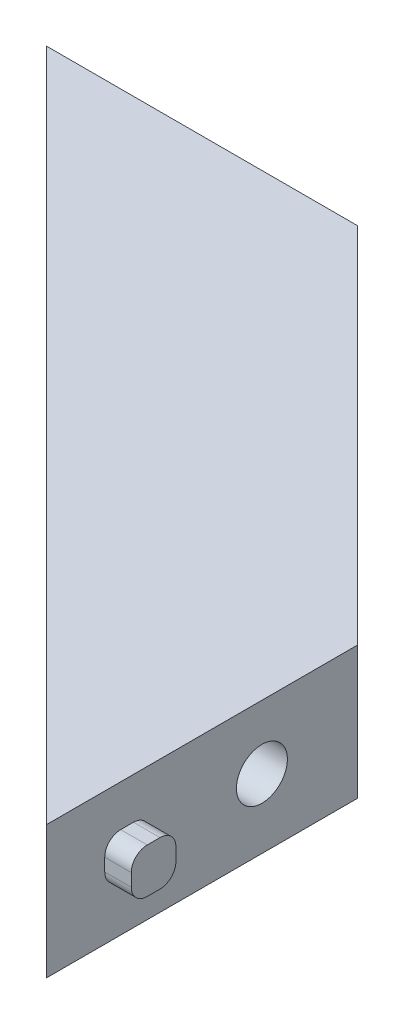
ISO-10303-21;
HEADER;
FILE_DESCRIPTION(('STEP AP214'),'2;1');
FILE_NAME('part.step','',(''),(''),'','','');
FILE_SCHEMA(('AUTOMOTIVE_DESIGN { 1 0 10303 214 1 1 1 1 }'));
ENDSEC;
DATA;
#1=APPLICATION_CONTEXT('core data for automotive mechanical design processes');
#2=APPLICATION_PROTOCOL_DEFINITION('international standard','automotive_design',2000,#1);
#3=PRODUCT_CONTEXT('',#1,'mechanical');
#4=PRODUCT('Part','Part','',(#3));
#5=PRODUCT_RELATED_PRODUCT_CATEGORY('part','',(#4));
#6=PRODUCT_DEFINITION_FORMATION('','',#4);
#7=PRODUCT_DEFINITION_CONTEXT('part definition',#1,'design');
#8=PRODUCT_DEFINITION('design','',#6,#7);
#9=PRODUCT_DEFINITION_SHAPE('','',#8);
#10=(LENGTH_UNIT() NAMED_UNIT(*) SI_UNIT(.MILLI.,.METRE.));
#11=(NAMED_UNIT(*) PLANE_ANGLE_UNIT() SI_UNIT($,.RADIAN.));
#12=(NAMED_UNIT(*) SI_UNIT($,.STERADIAN.) SOLID_ANGLE_UNIT());
#13=UNCERTAINTY_MEASURE_WITH_UNIT(LENGTH_MEASURE(1.E-05),#10,'distance_accuracy_value','');
#14=(GEOMETRIC_REPRESENTATION_CONTEXT(3) GLOBAL_UNCERTAINTY_ASSIGNED_CONTEXT((#13)) GLOBAL_UNIT_ASSIGNED_CONTEXT((#10,
#11,#12)) REPRESENTATION_CONTEXT('',''));
#15=CARTESIAN_POINT('',(0.,0.,0.));
#16=DIRECTION('',(0.,0.,1.));
#17=DIRECTION('',(1.,0.,0.));
#18=AXIS2_PLACEMENT_3D('',#15,#16,#17);
#19=CARTESIAN_POINT('',(1.74999999999999,6.49999999999973,11.45));
#20=DIRECTION('',(1.,0.,0.));
#21=DIRECTION('',(0.,0.,-1.));
#22=AXIS2_PLACEMENT_3D('',#19,#20,#21);
#23=CYLINDRICAL_SURFACE('',#22,2.4);
#24=CARTESIAN_POINT('',(31.75,6.49999999999973,11.45));
#25=DIRECTION('',(-1.,0.,0.));
#26=DIRECTION('',(0.,0.,1.));
#27=AXIS2_PLACEMENT_3D('',#24,#25,#26);
#28=CIRCLE('',#27,2.4);
#29=CARTESIAN_POINT('',(31.75,6.49999999999973,13.85));
#30=VERTEX_POINT('',#29);
#31=EDGE_CURVE('E222',#30,#30,#28,.T.);
#32=ORIENTED_EDGE('',*,*,#31,.F.);
#33=EDGE_LOOP('',(#32));
#34=FACE_BOUND('',#33,.T.);
#35=CARTESIAN_POINT('',(22.5938453699446,6.49999999999973,11.45));
#36=DIRECTION('',(-1.,0.,0.));
#37=DIRECTION('',(0.,0.,1.));
#38=AXIS2_PLACEMENT_3D('',#35,#36,#37);
#39=CIRCLE('',#38,2.4);
#40=CARTESIAN_POINT('',(22.5938453699446,6.49999999999973,13.85));
#41=VERTEX_POINT('',#40);
#42=EDGE_CURVE('E207',#41,#41,#39,.F.);
#43=ORIENTED_EDGE('',*,*,#42,.F.);
#44=EDGE_LOOP('',(#43));
#45=FACE_BOUND('',#44,.T.);
#46=ADVANCED_FACE('F32',(#34,#45),#23,.F.);
#47=CARTESIAN_POINT('',(-11.45,6.5,-1.75));
#48=DIRECTION('',(0.,0.,-1.));
#49=DIRECTION('',(-1.,0.,0.));
#50=AXIS2_PLACEMENT_3D('',#47,#48,#49);
#51=CYLINDRICAL_SURFACE('',#50,2.4);
#52=CARTESIAN_POINT('',(-11.45,6.5,-31.75));
#53=DIRECTION('',(0.,0.,1.));
#54=DIRECTION('',(1.,0.,0.));
#55=AXIS2_PLACEMENT_3D('',#52,#53,#54);
#56=CIRCLE('',#55,2.4);
#57=CARTESIAN_POINT('',(-9.05,6.5,-31.75));
#58=VERTEX_POINT('',#57);
#59=EDGE_CURVE('E206',#58,#58,#56,.T.);
#60=ORIENTED_EDGE('',*,*,#59,.F.);
#61=EDGE_LOOP('',(#60));
#62=FACE_BOUND('',#61,.T.);
#63=CARTESIAN_POINT('',(-11.45,6.5,-22.3111653809512));
#64=DIRECTION('',(0.,0.,1.));
#65=DIRECTION('',(1.,0.,0.));
#66=AXIS2_PLACEMENT_3D('',#63,#64,#65);
#67=CIRCLE('',#66,2.4);
#68=CARTESIAN_POINT('',(-9.05,6.5,-22.3111653809512));
#69=VERTEX_POINT('',#68);
#70=EDGE_CURVE('E200',#69,#69,#67,.F.);
#71=ORIENTED_EDGE('',*,*,#70,.F.);
#72=EDGE_LOOP('',(#71));
#73=FACE_BOUND('',#72,.T.);
#74=ADVANCED_FACE('F408',(#62,#73),#51,.F.);
#75=CARTESIAN_POINT('',(-31.75,12.5,-31.75));
#76=DIRECTION('',(0.,0.,1.));
#77=DIRECTION('',(1.,0.,0.));
#78=AXIS2_PLACEMENT_3D('',#75,#76,#77);
#79=PLANE('',#78);
#80=ORIENTED_EDGE('',*,*,#59,.T.);
#81=EDGE_LOOP('',(#80));
#82=FACE_BOUND('',#81,.T.);
#83=DIRECTION('',(-1.,0.,0.));
#84=VECTOR('',#83,1.);
#85=CARTESIAN_POINT('',(-31.75,12.5,-31.75));
#86=LINE('',#85,#84);
#87=CARTESIAN_POINT('',(-2.43430401491056,12.5,-31.75));
#88=VERTEX_POINT('',#87);
#89=CARTESIAN_POINT('',(-31.75,12.5,-31.75));
#90=VERTEX_POINT('',#89);
#91=EDGE_CURVE('E184',#88,#90,#86,.T.);
#92=ORIENTED_EDGE('',*,*,#91,.F.);
#93=DIRECTION('',(0.,1.,0.));
#94=VECTOR('',#93,1.);
#95=CARTESIAN_POINT('',(-2.43430401491056,0.,-31.75));
#96=LINE('',#95,#94);
#97=CARTESIAN_POINT('',(-2.43430401491056,0.,-31.75));
#98=VERTEX_POINT('',#97);
#99=EDGE_CURVE('E171',#98,#88,#96,.T.);
#100=ORIENTED_EDGE('',*,*,#99,.F.);
#101=DIRECTION('',(-1.,0.,0.));
#102=VECTOR('',#101,1.);
#103=CARTESIAN_POINT('',(-31.75,0.,-31.75));
#104=LINE('',#103,#102);
#105=CARTESIAN_POINT('',(-31.75,0.,-31.75));
#106=VERTEX_POINT('',#105);
#107=EDGE_CURVE('E183',#98,#106,#104,.T.);
#108=ORIENTED_EDGE('',*,*,#107,.T.);
#109=DIRECTION('',(0.,-1.,0.));
#110=VECTOR('',#109,1.);
#111=CARTESIAN_POINT('',(-31.75,12.5,-31.75));
#112=LINE('',#111,#110);
#113=EDGE_CURVE('E11',#90,#106,#112,.T.);
#114=ORIENTED_EDGE('',*,*,#113,.F.);
#115=EDGE_LOOP('',(#92,#100,#108,#114));
#116=FACE_BOUND('',#115,.T.);
#117=CARTESIAN_POINT('',(-24.75,5.9,-31.75));
#118=DIRECTION('',(0.,0.,-1.));
#119=DIRECTION('',(-1.,0.,0.));
#120=AXIS2_PLACEMENT_3D('',#117,#118,#119);
#121=CIRCLE('',#120,1.5);
#122=CARTESIAN_POINT('',(-24.75,4.4,-31.75));
#123=VERTEX_POINT('',#122);
#124=CARTESIAN_POINT('',(-26.25,5.90000000000001,-31.75));
#125=VERTEX_POINT('',#124);
#126=EDGE_CURVE('E226',#123,#125,#121,.T.);
#127=ORIENTED_EDGE('',*,*,#126,.F.);
#128=DIRECTION('',(-1.,0.,0.));
#129=VECTOR('',#128,1.);
#130=CARTESIAN_POINT('',(-24.75,4.4,-31.75));
#131=LINE('',#130,#129);
#132=CARTESIAN_POINT('',(-23.55,4.4,-31.75));
#133=VERTEX_POINT('',#132);
#134=EDGE_CURVE('E232',#133,#123,#131,.T.);
#135=ORIENTED_EDGE('',*,*,#134,.F.);
#136=CARTESIAN_POINT('',(-23.55,5.9,-31.75));
#137=DIRECTION('',(0.,0.,-1.));
#138=DIRECTION('',(1.,0.,0.));
#139=AXIS2_PLACEMENT_3D('',#136,#137,#138);
#140=CIRCLE('',#139,1.5);
#141=CARTESIAN_POINT('',(-22.05,5.9,-31.75));
#142=VERTEX_POINT('',#141);
#143=EDGE_CURVE('E262',#142,#133,#140,.T.);
#144=ORIENTED_EDGE('',*,*,#143,.F.);
#145=DIRECTION('',(0.,-1.,0.));
#146=VECTOR('',#145,1.);
#147=CARTESIAN_POINT('',(-22.05,5.90000000000001,-31.75));
#148=LINE('',#147,#146);
#149=CARTESIAN_POINT('',(-22.05,7.09999999999999,-31.75));
#150=VERTEX_POINT('',#149);
#151=EDGE_CURVE('E259',#150,#142,#148,.T.);
#152=ORIENTED_EDGE('',*,*,#151,.F.);
#153=CARTESIAN_POINT('',(-23.55,7.1,-31.75));
#154=DIRECTION('',(0.,0.,-1.));
#155=DIRECTION('',(-1.,0.,0.));
#156=AXIS2_PLACEMENT_3D('',#153,#154,#155);
#157=CIRCLE('',#156,1.5);
#158=CARTESIAN_POINT('',(-23.55,8.6,-31.75));
#159=VERTEX_POINT('',#158);
#160=EDGE_CURVE('E256',#159,#150,#157,.T.);
#161=ORIENTED_EDGE('',*,*,#160,.F.);
#162=DIRECTION('',(1.,0.,0.));
#163=VECTOR('',#162,1.);
#164=CARTESIAN_POINT('',(-24.75,8.6,-31.75));
#165=LINE('',#164,#163);
#166=CARTESIAN_POINT('',(-24.75,8.6,-31.75));
#167=VERTEX_POINT('',#166);
#168=EDGE_CURVE('E253',#167,#159,#165,.T.);
#169=ORIENTED_EDGE('',*,*,#168,.F.);
#170=CARTESIAN_POINT('',(-24.75,7.1,-31.75));
#171=DIRECTION('',(0.,0.,-1.));
#172=DIRECTION('',(-1.,0.,0.));
#173=AXIS2_PLACEMENT_3D('',#170,#171,#172);
#174=CIRCLE('',#173,1.5);
#175=CARTESIAN_POINT('',(-26.25,7.09999999999999,-31.75));
#176=VERTEX_POINT('',#175);
#177=EDGE_CURVE('E250',#176,#167,#174,.T.);
#178=ORIENTED_EDGE('',*,*,#177,.F.);
#179=DIRECTION('',(0.,1.,0.));
#180=VECTOR('',#179,1.);
#181=CARTESIAN_POINT('',(-26.25,5.90000000000001,-31.75));
#182=LINE('',#181,#180);
#183=EDGE_CURVE('E57',#125,#176,#182,.T.);
#184=ORIENTED_EDGE('',*,*,#183,.F.);
#185=EDGE_LOOP('',(#127,#135,#144,#152,#161,#169,#178,#184));
#186=FACE_BOUND('',#185,.T.);
#187=ADVANCED_FACE('F181',(#82,#116,#186),#79,.F.);
#188=CARTESIAN_POINT('',(31.75,12.5,31.75));
#189=DIRECTION('',(-1.,0.,0.));
#190=DIRECTION('',(0.,0.,1.));
#191=AXIS2_PLACEMENT_3D('',#188,#189,#190);
#192=PLANE('',#191);
#193=ORIENTED_EDGE('',*,*,#31,.T.);
#194=EDGE_LOOP('',(#193));
#195=FACE_BOUND('',#194,.T.);
#196=DIRECTION('',(0.,0.,-1.));
#197=VECTOR('',#196,1.);
#198=CARTESIAN_POINT('',(31.75,0.,31.75));
#199=LINE('',#198,#197);
#200=CARTESIAN_POINT('',(31.75,0.,31.75));
#201=VERTEX_POINT('',#200);
#202=CARTESIAN_POINT('',(31.75,0.,2.43430401491019));
#203=VERTEX_POINT('',#202);
#204=EDGE_CURVE('E189',#201,#203,#199,.T.);
#205=ORIENTED_EDGE('',*,*,#204,.T.);
#206=DIRECTION('',(0.,1.,0.));
#207=VECTOR('',#206,1.);
#208=CARTESIAN_POINT('',(31.75,0.,2.43430401491018));
#209=LINE('',#208,#207);
#210=CARTESIAN_POINT('',(31.75,12.5,2.43430401491018));
#211=VERTEX_POINT('',#210);
#212=EDGE_CURVE('E49',#203,#211,#209,.T.);
#213=ORIENTED_EDGE('',*,*,#212,.T.);
#214=DIRECTION('',(0.,0.,-1.));
#215=VECTOR('',#214,1.);
#216=CARTESIAN_POINT('',(31.75,12.5,31.75));
#217=LINE('',#216,#215);
#218=CARTESIAN_POINT('',(31.75,12.5,31.75));
#219=VERTEX_POINT('',#218);
#220=EDGE_CURVE('E191',#219,#211,#217,.T.);
#221=ORIENTED_EDGE('',*,*,#220,.F.);
#222=DIRECTION('',(0.,-1.,0.));
#223=VECTOR('',#222,1.);
#224=CARTESIAN_POINT('',(31.75,12.5,31.75));
#225=LINE('',#224,#223);
#226=EDGE_CURVE('E41',#219,#201,#225,.T.);
#227=ORIENTED_EDGE('',*,*,#226,.T.);
#228=EDGE_LOOP('',(#205,#213,#221,#227));
#229=FACE_BOUND('',#228,.T.);
#230=CARTESIAN_POINT('',(31.75,5.89999999999965,23.55));
#231=DIRECTION('',(1.,0.,0.));
#232=DIRECTION('',(0.,0.,-1.));
#233=AXIS2_PLACEMENT_3D('',#230,#231,#232);
#234=CIRCLE('',#233,1.5);
#235=CARTESIAN_POINT('',(31.75,4.39999999999965,23.55));
#236=VERTEX_POINT('',#235);
#237=CARTESIAN_POINT('',(31.75,5.89999999999966,22.05));
#238=VERTEX_POINT('',#237);
#239=EDGE_CURVE('E289',#236,#238,#234,.T.);
#240=ORIENTED_EDGE('',*,*,#239,.F.);
#241=DIRECTION('',(0.,0.,-1.));
#242=VECTOR('',#241,1.);
#243=CARTESIAN_POINT('',(31.75,4.39999999999965,24.75));
#244=LINE('',#243,#242);
#245=CARTESIAN_POINT('',(31.75,4.39999999999965,24.75));
#246=VERTEX_POINT('',#245);
#247=EDGE_CURVE('E294',#246,#236,#244,.T.);
#248=ORIENTED_EDGE('',*,*,#247,.F.);
#249=CARTESIAN_POINT('',(31.75,5.89999999999965,24.75));
#250=DIRECTION('',(1.,0.,0.));
#251=DIRECTION('',(0.,0.,1.));
#252=AXIS2_PLACEMENT_3D('',#249,#250,#251);
#253=CIRCLE('',#252,1.5);
#254=CARTESIAN_POINT('',(31.75,5.89999999999965,26.25));
#255=VERTEX_POINT('',#254);
#256=EDGE_CURVE('E326',#255,#246,#253,.T.);
#257=ORIENTED_EDGE('',*,*,#256,.F.);
#258=DIRECTION('',(0.,-1.,0.));
#259=VECTOR('',#258,1.);
#260=CARTESIAN_POINT('',(31.75,5.89999999999966,26.25));
#261=LINE('',#260,#259);
#262=CARTESIAN_POINT('',(31.75,7.09999999999963,26.25));
#263=VERTEX_POINT('',#262);
#264=EDGE_CURVE('E323',#263,#255,#261,.T.);
#265=ORIENTED_EDGE('',*,*,#264,.F.);
#266=CARTESIAN_POINT('',(31.75,7.09999999999965,24.75));
#267=DIRECTION('',(1.,0.,0.));
#268=DIRECTION('',(0.,0.,1.));
#269=AXIS2_PLACEMENT_3D('',#266,#267,#268);
#270=CIRCLE('',#269,1.5);
#271=CARTESIAN_POINT('',(31.75,8.59999999999965,24.75));
#272=VERTEX_POINT('',#271);
#273=EDGE_CURVE('E320',#272,#263,#270,.T.);
#274=ORIENTED_EDGE('',*,*,#273,.F.);
#275=DIRECTION('',(0.,0.,1.));
#276=VECTOR('',#275,1.);
#277=CARTESIAN_POINT('',(31.75,8.59999999999965,24.75));
#278=LINE('',#277,#276);
#279=CARTESIAN_POINT('',(31.75,8.59999999999965,23.55));
#280=VERTEX_POINT('',#279);
#281=EDGE_CURVE('E317',#280,#272,#278,.T.);
#282=ORIENTED_EDGE('',*,*,#281,.F.);
#283=CARTESIAN_POINT('',(31.75,7.09999999999965,23.55));
#284=DIRECTION('',(1.,0.,0.));
#285=DIRECTION('',(0.,0.,1.));
#286=AXIS2_PLACEMENT_3D('',#283,#284,#285);
#287=CIRCLE('',#286,1.5);
#288=CARTESIAN_POINT('',(31.75,7.09999999999963,22.05));
#289=VERTEX_POINT('',#288);
#290=EDGE_CURVE('E314',#289,#280,#287,.T.);
#291=ORIENTED_EDGE('',*,*,#290,.F.);
#292=DIRECTION('',(0.,1.,0.));
#293=VECTOR('',#292,1.);
#294=CARTESIAN_POINT('',(31.75,5.89999999999966,22.05));
#295=LINE('',#294,#293);
#296=EDGE_CURVE('E311',#238,#289,#295,.T.);
#297=ORIENTED_EDGE('',*,*,#296,.F.);
#298=EDGE_LOOP('',(#240,#248,#257,#265,#274,#282,#291,#297));
#299=FACE_BOUND('',#298,.T.);
#300=ADVANCED_FACE('F34',(#195,#229,#299),#192,.F.);
#301=CARTESIAN_POINT('',(-31.75,12.5,-31.75));
#302=DIRECTION('',(0.707106781186548,0.,-0.707106781186548));
#303=DIRECTION('',(-0.707106781186548,0.,-0.707106781186548));
#304=AXIS2_PLACEMENT_3D('',#301,#302,#303);
#305=PLANE('',#304);
#306=CARTESIAN_POINT('',(11.45,6.49999999999973,11.45));
#307=DIRECTION('',(0.707106781186548,0.,-0.707106781186548));
#308=DIRECTION('',(0.707106781186548,0.,0.707106781186548));
#309=AXIS2_PLACEMENT_3D('',#306,#307,#308);
#310=ELLIPSE('',#309,6.01040764008565,4.25);
#311=CARTESIAN_POINT('',(15.7,6.49999999999973,15.7));
#312=VERTEX_POINT('',#311);
#313=EDGE_CURVE('E36',#312,#312,#310,.F.);
#314=ORIENTED_EDGE('',*,*,#313,.F.);
#315=EDGE_LOOP('',(#314));
#316=FACE_BOUND('',#315,.T.);
#317=CARTESIAN_POINT('',(-11.45,6.5,-11.45));
#318=DIRECTION('',(0.707106781186548,0.,-0.707106781186548));
#319=DIRECTION('',(-0.707106781186548,0.,-0.707106781186548));
#320=AXIS2_PLACEMENT_3D('',#317,#318,#319);
#321=ELLIPSE('',#320,6.01040764008566,4.25);
#322=CARTESIAN_POINT('',(-15.7,6.5,-15.7));
#323=VERTEX_POINT('',#322);
#324=EDGE_CURVE('E203',#323,#323,#321,.F.);
#325=ORIENTED_EDGE('',*,*,#324,.F.);
#326=EDGE_LOOP('',(#325));
#327=FACE_BOUND('',#326,.T.);
#328=DIRECTION('',(0.707106781186548,0.,0.707106781186548));
#329=VECTOR('',#328,1.);
#330=CARTESIAN_POINT('',(-31.75,0.,-31.75));
#331=LINE('',#330,#329);
#332=EDGE_CURVE('E188',#106,#201,#331,.T.);
#333=ORIENTED_EDGE('',*,*,#332,.T.);
#334=ORIENTED_EDGE('',*,*,#226,.F.);
#335=DIRECTION('',(0.707106781186548,0.,0.707106781186548));
#336=VECTOR('',#335,1.);
#337=CARTESIAN_POINT('',(-31.75,12.5,-31.75));
#338=LINE('',#337,#336);
#339=EDGE_CURVE('E198',#90,#219,#338,.T.);
#340=ORIENTED_EDGE('',*,*,#339,.F.);
#341=ORIENTED_EDGE('',*,*,#113,.T.);
#342=EDGE_LOOP('',(#333,#334,#340,#341));
#343=FACE_BOUND('',#342,.T.);
#344=ADVANCED_FACE('F361',(#316,#327,#343),#305,.F.);
#345=CARTESIAN_POINT('',(0.,12.5,0.));
#346=DIRECTION('',(0.,-1.,0.));
#347=DIRECTION('',(0.,0.,-1.));
#348=AXIS2_PLACEMENT_3D('',#345,#346,#347);
#349=PLANE('',#348);
#350=ORIENTED_EDGE('',*,*,#220,.T.);
#351=DIRECTION('',(0.707106781186551,0.,0.707106781186544));
#352=VECTOR('',#351,1.);
#353=CARTESIAN_POINT('',(31.75,12.5,2.43430401491018));
#354=LINE('',#353,#352);
#355=EDGE_CURVE('E177',#88,#211,#354,.T.);
#356=ORIENTED_EDGE('',*,*,#355,.F.);
#357=ORIENTED_EDGE('',*,*,#91,.T.);
#358=ORIENTED_EDGE('',*,*,#339,.T.);
#359=EDGE_LOOP('',(#350,#356,#357,#358));
#360=FACE_BOUND('',#359,.T.);
#361=ADVANCED_FACE('F358',(#360),#349,.F.);
#362=CARTESIAN_POINT('',(0.,0.,0.));
#363=DIRECTION('',(0.,-1.,0.));
#364=DIRECTION('',(0.,0.,-1.));
#365=AXIS2_PLACEMENT_3D('',#362,#363,#364);
#366=PLANE('',#365);
#367=DIRECTION('',(0.707106781186551,0.,0.707106781186544));
#368=VECTOR('',#367,1.);
#369=CARTESIAN_POINT('',(31.75,0.,2.43430401491018));
#370=LINE('',#369,#368);
#371=EDGE_CURVE('E168',#98,#203,#370,.T.);
#372=ORIENTED_EDGE('',*,*,#371,.T.);
#373=ORIENTED_EDGE('',*,*,#204,.F.);
#374=ORIENTED_EDGE('',*,*,#332,.F.);
#375=ORIENTED_EDGE('',*,*,#107,.F.);
#376=EDGE_LOOP('',(#372,#373,#374,#375));
#377=FACE_BOUND('',#376,.T.);
#378=ADVANCED_FACE('F187',(#377),#366,.T.);
#379=CARTESIAN_POINT('',(34.25,5.89999999999965,23.55));
#380=DIRECTION('',(-1.,0.,0.));
#381=DIRECTION('',(0.,0.,1.));
#382=AXIS2_PLACEMENT_3D('',#379,#380,#381);
#383=CYLINDRICAL_SURFACE('',#382,1.5);
#384=ORIENTED_EDGE('',*,*,#239,.T.);
#385=DIRECTION('',(-1.,0.,0.));
#386=VECTOR('',#385,1.);
#387=CARTESIAN_POINT('',(34.25,5.89999999999966,22.05));
#388=LINE('',#387,#386);
#389=CARTESIAN_POINT('',(34.25,5.89999999999966,22.05));
#390=VERTEX_POINT('',#389);
#391=EDGE_CURVE('E193',#390,#238,#388,.T.);
#392=ORIENTED_EDGE('',*,*,#391,.F.);
#393=CARTESIAN_POINT('',(34.25,5.89999999999965,23.55));
#394=DIRECTION('',(1.,0.,0.));
#395=DIRECTION('',(0.,0.,-1.));
#396=AXIS2_PLACEMENT_3D('',#393,#394,#395);
#397=CIRCLE('',#396,1.5);
#398=CARTESIAN_POINT('',(34.25,4.39999999999965,23.55));
#399=VERTEX_POINT('',#398);
#400=EDGE_CURVE('E290',#399,#390,#397,.T.);
#401=ORIENTED_EDGE('',*,*,#400,.F.);
#402=DIRECTION('',(-1.,0.,0.));
#403=VECTOR('',#402,1.);
#404=CARTESIAN_POINT('',(34.25,4.39999999999965,23.55));
#405=LINE('',#404,#403);
#406=EDGE_CURVE('E308',#399,#236,#405,.T.);
#407=ORIENTED_EDGE('',*,*,#406,.T.);
#408=EDGE_LOOP('',(#384,#392,#401,#407));
#409=FACE_BOUND('',#408,.T.);
#410=ADVANCED_FACE('F374',(#409),#383,.T.);
#411=CARTESIAN_POINT('',(34.25,5.89999999999966,22.05));
#412=DIRECTION('',(0.,0.,1.));
#413=DIRECTION('',(1.,0.,0.));
#414=AXIS2_PLACEMENT_3D('',#411,#412,#413);
#415=PLANE('',#414);
#416=ORIENTED_EDGE('',*,*,#296,.T.);
#417=DIRECTION('',(-1.,0.,0.));
#418=VECTOR('',#417,1.);
#419=CARTESIAN_POINT('',(34.25,7.09999999999963,22.05));
#420=LINE('',#419,#418);
#421=CARTESIAN_POINT('',(34.25,7.09999999999963,22.05));
#422=VERTEX_POINT('',#421);
#423=EDGE_CURVE('E348',#422,#289,#420,.T.);
#424=ORIENTED_EDGE('',*,*,#423,.F.);
#425=DIRECTION('',(0.,1.,0.));
#426=VECTOR('',#425,1.);
#427=CARTESIAN_POINT('',(34.25,5.89999999999966,22.05));
#428=LINE('',#427,#426);
#429=EDGE_CURVE('E293',#390,#422,#428,.T.);
#430=ORIENTED_EDGE('',*,*,#429,.F.);
#431=ORIENTED_EDGE('',*,*,#391,.T.);
#432=EDGE_LOOP('',(#416,#424,#430,#431));
#433=FACE_BOUND('',#432,.T.);
#434=ADVANCED_FACE('F398',(#433),#415,.F.);
#435=CARTESIAN_POINT('',(34.25,7.09999999999965,23.55));
#436=DIRECTION('',(-1.,0.,0.));
#437=DIRECTION('',(0.,0.,1.));
#438=AXIS2_PLACEMENT_3D('',#435,#436,#437);
#439=CYLINDRICAL_SURFACE('',#438,1.5);
#440=ORIENTED_EDGE('',*,*,#290,.T.);
#441=DIRECTION('',(-1.,0.,0.));
#442=VECTOR('',#441,1.);
#443=CARTESIAN_POINT('',(34.25,8.59999999999965,23.55));
#444=LINE('',#443,#442);
#445=CARTESIAN_POINT('',(34.25,8.59999999999965,23.55));
#446=VERTEX_POINT('',#445);
#447=EDGE_CURVE('E345',#446,#280,#444,.T.);
#448=ORIENTED_EDGE('',*,*,#447,.F.);
#449=CARTESIAN_POINT('',(34.25,7.09999999999965,23.55));
#450=DIRECTION('',(1.,0.,0.));
#451=DIRECTION('',(0.,0.,1.));
#452=AXIS2_PLACEMENT_3D('',#449,#450,#451);
#453=CIRCLE('',#452,1.5);
#454=EDGE_CURVE('E296',#422,#446,#453,.T.);
#455=ORIENTED_EDGE('',*,*,#454,.F.);
#456=ORIENTED_EDGE('',*,*,#423,.T.);
#457=EDGE_LOOP('',(#440,#448,#455,#456));
#458=FACE_BOUND('',#457,.T.);
#459=ADVANCED_FACE('F396',(#458),#439,.T.);
#460=CARTESIAN_POINT('',(34.25,8.59999999999965,24.75));
#461=DIRECTION('',(0.,-1.,0.));
#462=DIRECTION('',(0.,0.,-1.));
#463=AXIS2_PLACEMENT_3D('',#460,#461,#462);
#464=PLANE('',#463);
#465=ORIENTED_EDGE('',*,*,#281,.T.);
#466=DIRECTION('',(-1.,0.,0.));
#467=VECTOR('',#466,1.);
#468=CARTESIAN_POINT('',(34.25,8.59999999999965,24.75));
#469=LINE('',#468,#467);
#470=CARTESIAN_POINT('',(34.25,8.59999999999965,24.75));
#471=VERTEX_POINT('',#470);
#472=EDGE_CURVE('E342',#471,#272,#469,.T.);
#473=ORIENTED_EDGE('',*,*,#472,.F.);
#474=DIRECTION('',(0.,0.,1.));
#475=VECTOR('',#474,1.);
#476=CARTESIAN_POINT('',(34.25,8.59999999999965,24.75));
#477=LINE('',#476,#475);
#478=EDGE_CURVE('E298',#446,#471,#477,.T.);
#479=ORIENTED_EDGE('',*,*,#478,.F.);
#480=ORIENTED_EDGE('',*,*,#447,.T.);
#481=EDGE_LOOP('',(#465,#473,#479,#480));
#482=FACE_BOUND('',#481,.T.);
#483=ADVANCED_FACE('F391',(#482),#464,.F.);
#484=CARTESIAN_POINT('',(34.25,7.09999999999965,24.75));
#485=DIRECTION('',(-1.,0.,0.));
#486=DIRECTION('',(0.,0.,1.));
#487=AXIS2_PLACEMENT_3D('',#484,#485,#486);
#488=CYLINDRICAL_SURFACE('',#487,1.5);
#489=ORIENTED_EDGE('',*,*,#273,.T.);
#490=DIRECTION('',(-1.,0.,0.));
#491=VECTOR('',#490,1.);
#492=CARTESIAN_POINT('',(34.25,7.09999999999963,26.25));
#493=LINE('',#492,#491);
#494=CARTESIAN_POINT('',(34.25,7.09999999999963,26.25));
#495=VERTEX_POINT('',#494);
#496=EDGE_CURVE('E339',#495,#263,#493,.T.);
#497=ORIENTED_EDGE('',*,*,#496,.F.);
#498=CARTESIAN_POINT('',(34.25,7.09999999999965,24.75));
#499=DIRECTION('',(1.,0.,0.));
#500=DIRECTION('',(0.,0.,1.));
#501=AXIS2_PLACEMENT_3D('',#498,#499,#500);
#502=CIRCLE('',#501,1.5);
#503=EDGE_CURVE('E300',#471,#495,#502,.T.);
#504=ORIENTED_EDGE('',*,*,#503,.F.);
#505=ORIENTED_EDGE('',*,*,#472,.T.);
#506=EDGE_LOOP('',(#489,#497,#504,#505));
#507=FACE_BOUND('',#506,.T.);
#508=ADVANCED_FACE('F388',(#507),#488,.T.);
#509=CARTESIAN_POINT('',(34.25,5.89999999999966,26.25));
#510=DIRECTION('',(0.,0.,-1.));
#511=DIRECTION('',(-1.,0.,0.));
#512=AXIS2_PLACEMENT_3D('',#509,#510,#511);
#513=PLANE('',#512);
#514=ORIENTED_EDGE('',*,*,#264,.T.);
#515=DIRECTION('',(-1.,0.,0.));
#516=VECTOR('',#515,1.);
#517=CARTESIAN_POINT('',(34.25,5.89999999999965,26.25));
#518=LINE('',#517,#516);
#519=CARTESIAN_POINT('',(34.25,5.89999999999965,26.25));
#520=VERTEX_POINT('',#519);
#521=EDGE_CURVE('E336',#520,#255,#518,.T.);
#522=ORIENTED_EDGE('',*,*,#521,.F.);
#523=DIRECTION('',(0.,-1.,0.));
#524=VECTOR('',#523,1.);
#525=CARTESIAN_POINT('',(34.25,5.89999999999966,26.25));
#526=LINE('',#525,#524);
#527=EDGE_CURVE('E302',#495,#520,#526,.T.);
#528=ORIENTED_EDGE('',*,*,#527,.F.);
#529=ORIENTED_EDGE('',*,*,#496,.T.);
#530=EDGE_LOOP('',(#514,#522,#528,#529));
#531=FACE_BOUND('',#530,.T.);
#532=ADVANCED_FACE('F384',(#531),#513,.F.);
#533=CARTESIAN_POINT('',(34.25,5.89999999999965,24.75));
#534=DIRECTION('',(-1.,0.,0.));
#535=DIRECTION('',(0.,0.,1.));
#536=AXIS2_PLACEMENT_3D('',#533,#534,#535);
#537=CYLINDRICAL_SURFACE('',#536,1.5);
#538=ORIENTED_EDGE('',*,*,#256,.T.);
#539=DIRECTION('',(-1.,0.,0.));
#540=VECTOR('',#539,1.);
#541=CARTESIAN_POINT('',(34.25,4.39999999999965,24.75));
#542=LINE('',#541,#540);
#543=CARTESIAN_POINT('',(34.25,4.39999999999965,24.75));
#544=VERTEX_POINT('',#543);
#545=EDGE_CURVE('E333',#544,#246,#542,.T.);
#546=ORIENTED_EDGE('',*,*,#545,.F.);
#547=CARTESIAN_POINT('',(34.25,5.89999999999965,24.75));
#548=DIRECTION('',(1.,0.,0.));
#549=DIRECTION('',(0.,0.,1.));
#550=AXIS2_PLACEMENT_3D('',#547,#548,#549);
#551=CIRCLE('',#550,1.5);
#552=EDGE_CURVE('E304',#520,#544,#551,.T.);
#553=ORIENTED_EDGE('',*,*,#552,.F.);
#554=ORIENTED_EDGE('',*,*,#521,.T.);
#555=EDGE_LOOP('',(#538,#546,#553,#554));
#556=FACE_BOUND('',#555,.T.);
#557=ADVANCED_FACE('F382',(#556),#537,.T.);
#558=CARTESIAN_POINT('',(34.25,4.39999999999965,24.75));
#559=DIRECTION('',(0.,1.,0.));
#560=DIRECTION('',(0.,0.,1.));
#561=AXIS2_PLACEMENT_3D('',#558,#559,#560);
#562=PLANE('',#561);
#563=ORIENTED_EDGE('',*,*,#247,.T.);
#564=ORIENTED_EDGE('',*,*,#406,.F.);
#565=DIRECTION('',(0.,0.,-1.));
#566=VECTOR('',#565,1.);
#567=CARTESIAN_POINT('',(34.25,4.39999999999965,24.75));
#568=LINE('',#567,#566);
#569=EDGE_CURVE('E306',#544,#399,#568,.T.);
#570=ORIENTED_EDGE('',*,*,#569,.F.);
#571=ORIENTED_EDGE('',*,*,#545,.T.);
#572=EDGE_LOOP('',(#563,#564,#570,#571));
#573=FACE_BOUND('',#572,.T.);
#574=ADVANCED_FACE('F370',(#573),#562,.F.);
#575=CARTESIAN_POINT('',(34.25,5.89999999999965,23.55));
#576=DIRECTION('',(1.,0.,0.));
#577=DIRECTION('',(0.,0.,-1.));
#578=AXIS2_PLACEMENT_3D('',#575,#576,#577);
#579=PLANE('',#578);
#580=ORIENTED_EDGE('',*,*,#400,.T.);
#581=ORIENTED_EDGE('',*,*,#429,.T.);
#582=ORIENTED_EDGE('',*,*,#454,.T.);
#583=ORIENTED_EDGE('',*,*,#478,.T.);
#584=ORIENTED_EDGE('',*,*,#503,.T.);
#585=ORIENTED_EDGE('',*,*,#527,.T.);
#586=ORIENTED_EDGE('',*,*,#552,.T.);
#587=ORIENTED_EDGE('',*,*,#569,.T.);
#588=EDGE_LOOP('',(#580,#581,#582,#583,#584,#585,#586,#587));
#589=FACE_BOUND('',#588,.T.);
#590=ADVANCED_FACE('F376',(#589),#579,.T.);
#591=CARTESIAN_POINT('',(-24.75,5.9,-34.25));
#592=DIRECTION('',(0.,0.,1.));
#593=DIRECTION('',(1.,0.,0.));
#594=AXIS2_PLACEMENT_3D('',#591,#592,#593);
#595=CYLINDRICAL_SURFACE('',#594,1.5);
#596=ORIENTED_EDGE('',*,*,#126,.T.);
#597=DIRECTION('',(0.,0.,1.));
#598=VECTOR('',#597,1.);
#599=CARTESIAN_POINT('',(-26.25,5.90000000000001,-34.25));
#600=LINE('',#599,#598);
#601=CARTESIAN_POINT('',(-26.25,5.90000000000001,-34.25));
#602=VERTEX_POINT('',#601);
#603=EDGE_CURVE('E287',#602,#125,#600,.T.);
#604=ORIENTED_EDGE('',*,*,#603,.F.);
#605=CARTESIAN_POINT('',(-24.75,5.9,-34.25));
#606=DIRECTION('',(0.,0.,-1.));
#607=DIRECTION('',(-1.,0.,0.));
#608=AXIS2_PLACEMENT_3D('',#605,#606,#607);
#609=CIRCLE('',#608,1.5);
#610=CARTESIAN_POINT('',(-24.75,4.4,-34.25));
#611=VERTEX_POINT('',#610);
#612=EDGE_CURVE('E228',#611,#602,#609,.T.);
#613=ORIENTED_EDGE('',*,*,#612,.F.);
#614=DIRECTION('',(0.,0.,1.));
#615=VECTOR('',#614,1.);
#616=CARTESIAN_POINT('',(-24.75,4.4,-34.25));
#617=LINE('',#616,#615);
#618=EDGE_CURVE('E246',#611,#123,#617,.T.);
#619=ORIENTED_EDGE('',*,*,#618,.T.);
#620=EDGE_LOOP('',(#596,#604,#613,#619));
#621=FACE_BOUND('',#620,.T.);
#622=ADVANCED_FACE('F456',(#621),#595,.T.);
#623=CARTESIAN_POINT('',(-26.25,5.90000000000001,-34.25));
#624=DIRECTION('',(1.,0.,0.));
#625=DIRECTION('',(0.,0.,-1.));
#626=AXIS2_PLACEMENT_3D('',#623,#624,#625);
#627=PLANE('',#626);
#628=ORIENTED_EDGE('',*,*,#183,.T.);
#629=DIRECTION('',(0.,0.,1.));
#630=VECTOR('',#629,1.);
#631=CARTESIAN_POINT('',(-26.25,7.09999999999999,-34.25));
#632=LINE('',#631,#630);
#633=CARTESIAN_POINT('',(-26.25,7.09999999999999,-34.25));
#634=VERTEX_POINT('',#633);
#635=EDGE_CURVE('E284',#634,#176,#632,.T.);
#636=ORIENTED_EDGE('',*,*,#635,.F.);
#637=DIRECTION('',(0.,1.,0.));
#638=VECTOR('',#637,1.);
#639=CARTESIAN_POINT('',(-26.25,5.90000000000001,-34.25));
#640=LINE('',#639,#638);
#641=EDGE_CURVE('E231',#602,#634,#640,.T.);
#642=ORIENTED_EDGE('',*,*,#641,.F.);
#643=ORIENTED_EDGE('',*,*,#603,.T.);
#644=EDGE_LOOP('',(#628,#636,#642,#643));
#645=FACE_BOUND('',#644,.T.);
#646=ADVANCED_FACE('F452',(#645),#627,.F.);
#647=CARTESIAN_POINT('',(-24.75,7.1,-34.25));
#648=DIRECTION('',(0.,0.,1.));
#649=DIRECTION('',(1.,0.,0.));
#650=AXIS2_PLACEMENT_3D('',#647,#648,#649);
#651=CYLINDRICAL_SURFACE('',#650,1.5);
#652=ORIENTED_EDGE('',*,*,#177,.T.);
#653=DIRECTION('',(0.,0.,1.));
#654=VECTOR('',#653,1.);
#655=CARTESIAN_POINT('',(-24.75,8.6,-34.25));
#656=LINE('',#655,#654);
#657=CARTESIAN_POINT('',(-24.75,8.6,-34.25));
#658=VERTEX_POINT('',#657);
#659=EDGE_CURVE('E281',#658,#167,#656,.T.);
#660=ORIENTED_EDGE('',*,*,#659,.F.);
#661=CARTESIAN_POINT('',(-24.75,7.1,-34.25));
#662=DIRECTION('',(0.,0.,-1.));
#663=DIRECTION('',(-1.,0.,0.));
#664=AXIS2_PLACEMENT_3D('',#661,#662,#663);
#665=CIRCLE('',#664,1.5);
#666=EDGE_CURVE('E234',#634,#658,#665,.T.);
#667=ORIENTED_EDGE('',*,*,#666,.F.);
#668=ORIENTED_EDGE('',*,*,#635,.T.);
#669=EDGE_LOOP('',(#652,#660,#667,#668));
#670=FACE_BOUND('',#669,.T.);
#671=ADVANCED_FACE('F448',(#670),#651,.T.);
#672=CARTESIAN_POINT('',(-24.75,8.6,-34.25));
#673=DIRECTION('',(0.,-1.,0.));
#674=DIRECTION('',(0.,0.,-1.));
#675=AXIS2_PLACEMENT_3D('',#672,#673,#674);
#676=PLANE('',#675);
#677=ORIENTED_EDGE('',*,*,#168,.T.);
#678=DIRECTION('',(0.,0.,1.));
#679=VECTOR('',#678,1.);
#680=CARTESIAN_POINT('',(-23.55,8.6,-34.25));
#681=LINE('',#680,#679);
#682=CARTESIAN_POINT('',(-23.55,8.6,-34.25));
#683=VERTEX_POINT('',#682);
#684=EDGE_CURVE('E278',#683,#159,#681,.T.);
#685=ORIENTED_EDGE('',*,*,#684,.F.);
#686=DIRECTION('',(1.,0.,0.));
#687=VECTOR('',#686,1.);
#688=CARTESIAN_POINT('',(-24.75,8.6,-34.25));
#689=LINE('',#688,#687);
#690=EDGE_CURVE('E236',#658,#683,#689,.T.);
#691=ORIENTED_EDGE('',*,*,#690,.F.);
#692=ORIENTED_EDGE('',*,*,#659,.T.);
#693=EDGE_LOOP('',(#677,#685,#691,#692));
#694=FACE_BOUND('',#693,.T.);
#695=ADVANCED_FACE('F444',(#694),#676,.F.);
#696=CARTESIAN_POINT('',(-23.55,7.1,-34.25));
#697=DIRECTION('',(0.,0.,1.));
#698=DIRECTION('',(1.,0.,0.));
#699=AXIS2_PLACEMENT_3D('',#696,#697,#698);
#700=CYLINDRICAL_SURFACE('',#699,1.5);
#701=ORIENTED_EDGE('',*,*,#160,.T.);
#702=DIRECTION('',(0.,0.,1.));
#703=VECTOR('',#702,1.);
#704=CARTESIAN_POINT('',(-22.05,7.09999999999999,-34.25));
#705=LINE('',#704,#703);
#706=CARTESIAN_POINT('',(-22.05,7.09999999999999,-34.25));
#707=VERTEX_POINT('',#706);
#708=EDGE_CURVE('E275',#707,#150,#705,.T.);
#709=ORIENTED_EDGE('',*,*,#708,.F.);
#710=CARTESIAN_POINT('',(-23.55,7.1,-34.25));
#711=DIRECTION('',(0.,0.,-1.));
#712=DIRECTION('',(-1.,0.,0.));
#713=AXIS2_PLACEMENT_3D('',#710,#711,#712);
#714=CIRCLE('',#713,1.5);
#715=EDGE_CURVE('E238',#683,#707,#714,.T.);
#716=ORIENTED_EDGE('',*,*,#715,.F.);
#717=ORIENTED_EDGE('',*,*,#684,.T.);
#718=EDGE_LOOP('',(#701,#709,#716,#717));
#719=FACE_BOUND('',#718,.T.);
#720=ADVANCED_FACE('F440',(#719),#700,.T.);
#721=CARTESIAN_POINT('',(-22.05,5.90000000000001,-34.25));
#722=DIRECTION('',(-1.,0.,0.));
#723=DIRECTION('',(0.,0.,1.));
#724=AXIS2_PLACEMENT_3D('',#721,#722,#723);
#725=PLANE('',#724);
#726=ORIENTED_EDGE('',*,*,#151,.T.);
#727=DIRECTION('',(0.,0.,1.));
#728=VECTOR('',#727,1.);
#729=CARTESIAN_POINT('',(-22.05,5.9,-34.25));
#730=LINE('',#729,#728);
#731=CARTESIAN_POINT('',(-22.05,5.9,-34.25));
#732=VERTEX_POINT('',#731);
#733=EDGE_CURVE('E272',#732,#142,#730,.T.);
#734=ORIENTED_EDGE('',*,*,#733,.F.);
#735=DIRECTION('',(0.,-1.,0.));
#736=VECTOR('',#735,1.);
#737=CARTESIAN_POINT('',(-22.05,5.90000000000001,-34.25));
#738=LINE('',#737,#736);
#739=EDGE_CURVE('E240',#707,#732,#738,.T.);
#740=ORIENTED_EDGE('',*,*,#739,.F.);
#741=ORIENTED_EDGE('',*,*,#708,.T.);
#742=EDGE_LOOP('',(#726,#734,#740,#741));
#743=FACE_BOUND('',#742,.T.);
#744=ADVANCED_FACE('F436',(#743),#725,.F.);
#745=CARTESIAN_POINT('',(-23.55,5.9,-34.25));
#746=DIRECTION('',(0.,0.,1.));
#747=DIRECTION('',(1.,0.,0.));
#748=AXIS2_PLACEMENT_3D('',#745,#746,#747);
#749=CYLINDRICAL_SURFACE('',#748,1.5);
#750=ORIENTED_EDGE('',*,*,#143,.T.);
#751=DIRECTION('',(0.,0.,1.));
#752=VECTOR('',#751,1.);
#753=CARTESIAN_POINT('',(-23.55,4.4,-34.25));
#754=LINE('',#753,#752);
#755=CARTESIAN_POINT('',(-23.55,4.4,-34.25));
#756=VERTEX_POINT('',#755);
#757=EDGE_CURVE('E269',#756,#133,#754,.T.);
#758=ORIENTED_EDGE('',*,*,#757,.F.);
#759=CARTESIAN_POINT('',(-23.55,5.9,-34.25));
#760=DIRECTION('',(0.,0.,-1.));
#761=DIRECTION('',(1.,0.,0.));
#762=AXIS2_PLACEMENT_3D('',#759,#760,#761);
#763=CIRCLE('',#762,1.5);
#764=EDGE_CURVE('E242',#732,#756,#763,.T.);
#765=ORIENTED_EDGE('',*,*,#764,.F.);
#766=ORIENTED_EDGE('',*,*,#733,.T.);
#767=EDGE_LOOP('',(#750,#758,#765,#766));
#768=FACE_BOUND('',#767,.T.);
#769=ADVANCED_FACE('F432',(#768),#749,.T.);
#770=CARTESIAN_POINT('',(-24.75,4.4,-34.25));
#771=DIRECTION('',(0.,1.,0.));
#772=DIRECTION('',(0.,0.,1.));
#773=AXIS2_PLACEMENT_3D('',#770,#771,#772);
#774=PLANE('',#773);
#775=ORIENTED_EDGE('',*,*,#134,.T.);
#776=ORIENTED_EDGE('',*,*,#618,.F.);
#777=DIRECTION('',(-1.,0.,0.));
#778=VECTOR('',#777,1.);
#779=CARTESIAN_POINT('',(-24.75,4.4,-34.25));
#780=LINE('',#779,#778);
#781=EDGE_CURVE('E244',#756,#611,#780,.T.);
#782=ORIENTED_EDGE('',*,*,#781,.F.);
#783=ORIENTED_EDGE('',*,*,#757,.T.);
#784=EDGE_LOOP('',(#775,#776,#782,#783));
#785=FACE_BOUND('',#784,.T.);
#786=ADVANCED_FACE('F428',(#785),#774,.F.);
#787=CARTESIAN_POINT('',(-24.75,5.9,-34.25));
#788=DIRECTION('',(0.,0.,-1.));
#789=DIRECTION('',(-1.,0.,0.));
#790=AXIS2_PLACEMENT_3D('',#787,#788,#789);
#791=PLANE('',#790);
#792=ORIENTED_EDGE('',*,*,#612,.T.);
#793=ORIENTED_EDGE('',*,*,#641,.T.);
#794=ORIENTED_EDGE('',*,*,#666,.T.);
#795=ORIENTED_EDGE('',*,*,#690,.T.);
#796=ORIENTED_EDGE('',*,*,#715,.T.);
#797=ORIENTED_EDGE('',*,*,#739,.T.);
#798=ORIENTED_EDGE('',*,*,#764,.T.);
#799=ORIENTED_EDGE('',*,*,#781,.T.);
#800=EDGE_LOOP('',(#792,#793,#794,#795,#796,#797,#798,#799));
#801=FACE_BOUND('',#800,.T.);
#802=ADVANCED_FACE('F425',(#801),#791,.T.);
#803=CARTESIAN_POINT('',(31.75,0.,2.43430401491018));
#804=DIRECTION('',(-0.707106781186544,0.,0.707106781186551));
#805=DIRECTION('',(0.707106781186551,0.,0.707106781186544));
#806=AXIS2_PLACEMENT_3D('',#803,#804,#805);
#807=PLANE('',#806);
#808=ORIENTED_EDGE('',*,*,#355,.T.);
#809=ORIENTED_EDGE('',*,*,#212,.F.);
#810=ORIENTED_EDGE('',*,*,#371,.F.);
#811=ORIENTED_EDGE('',*,*,#99,.T.);
#812=EDGE_LOOP('',(#808,#809,#810,#811));
#813=FACE_BOUND('',#812,.T.);
#814=ADVANCED_FACE('F170',(#813),#807,.F.);
#815=CARTESIAN_POINT('',(-11.45,6.5,2.68883461904881));
#816=DIRECTION('',(0.,0.,-1.));
#817=DIRECTION('',(-1.,0.,0.));
#818=AXIS2_PLACEMENT_3D('',#815,#816,#817);
#819=CYLINDRICAL_SURFACE('',#818,4.25);
#820=CARTESIAN_POINT('',(-11.45,6.5,-22.3111653809512));
#821=DIRECTION('',(0.,0.,1.));
#822=DIRECTION('',(1.,0.,0.));
#823=AXIS2_PLACEMENT_3D('',#820,#821,#822);
#824=CIRCLE('',#823,4.25);
#825=CARTESIAN_POINT('',(-7.2,6.5,-22.3111653809512));
#826=VERTEX_POINT('',#825);
#827=EDGE_CURVE('E204',#826,#826,#824,.T.);
#828=ORIENTED_EDGE('',*,*,#827,.F.);
#829=EDGE_LOOP('',(#828));
#830=FACE_BOUND('',#829,.T.);
#831=ORIENTED_EDGE('',*,*,#324,.T.);
#832=EDGE_LOOP('',(#831));
#833=FACE_BOUND('',#832,.T.);
#834=ADVANCED_FACE('F424',(#830,#833),#819,.F.);
#835=CARTESIAN_POINT('',(-11.45,6.5,-22.3111653809512));
#836=DIRECTION('',(0.,0.,1.));
#837=DIRECTION('',(1.,0.,0.));
#838=AXIS2_PLACEMENT_3D('',#835,#836,#837);
#839=PLANE('',#838);
#840=ORIENTED_EDGE('',*,*,#827,.T.);
#841=EDGE_LOOP('',(#840));
#842=FACE_BOUND('',#841,.T.);
#843=ORIENTED_EDGE('',*,*,#70,.T.);
#844=EDGE_LOOP('',(#843));
#845=FACE_BOUND('',#844,.T.);
#846=ADVANCED_FACE('F557',(#842,#845),#839,.T.);
#847=CARTESIAN_POINT('',(-2.40615463005542,6.49999999999973,11.45));
#848=DIRECTION('',(1.,0.,0.));
#849=DIRECTION('',(0.,0.,-1.));
#850=AXIS2_PLACEMENT_3D('',#847,#848,#849);
#851=CYLINDRICAL_SURFACE('',#850,4.25);
#852=CARTESIAN_POINT('',(22.5938453699446,6.49999999999973,11.45));
#853=DIRECTION('',(-1.,0.,0.));
#854=DIRECTION('',(0.,0.,1.));
#855=AXIS2_PLACEMENT_3D('',#852,#853,#854);
#856=CIRCLE('',#855,4.25);
#857=CARTESIAN_POINT('',(22.5938453699446,6.49999999999973,15.7));
#858=VERTEX_POINT('',#857);
#859=EDGE_CURVE('E209',#858,#858,#856,.T.);
#860=ORIENTED_EDGE('',*,*,#859,.F.);
#861=EDGE_LOOP('',(#860));
#862=FACE_BOUND('',#861,.T.);
#863=ORIENTED_EDGE('',*,*,#313,.T.);
#864=EDGE_LOOP('',(#863));
#865=FACE_BOUND('',#864,.T.);
#866=ADVANCED_FACE('F562',(#862,#865),#851,.F.);
#867=CARTESIAN_POINT('',(22.5938453699446,6.49999999999973,11.45));
#868=DIRECTION('',(-1.,0.,0.));
#869=DIRECTION('',(0.,0.,1.));
#870=AXIS2_PLACEMENT_3D('',#867,#868,#869);
#871=PLANE('',#870);
#872=ORIENTED_EDGE('',*,*,#859,.T.);
#873=EDGE_LOOP('',(#872));
#874=FACE_BOUND('',#873,.T.);
#875=ORIENTED_EDGE('',*,*,#42,.T.);
#876=EDGE_LOOP('',(#875));
#877=FACE_BOUND('',#876,.T.);
#878=ADVANCED_FACE('F569',(#874,#877),#871,.T.);
#879=CLOSED_SHELL('',(#46,#74,#187,#300,#344,#361,#378,#410,#434,#459,#483,#508,#532,#557,#574,
#590,#622,#646,#671,#695,#720,#744,#769,#786,#802,#814,#834,#846,#866,#878));
#880=MANIFOLD_SOLID_BREP('B2',#879);
#881=ADVANCED_BREP_SHAPE_REPRESENTATION('',(#18,#880),#14);
#882=SHAPE_DEFINITION_REPRESENTATION(#9,#881);
ENDSEC;
END-ISO-10303-21;
